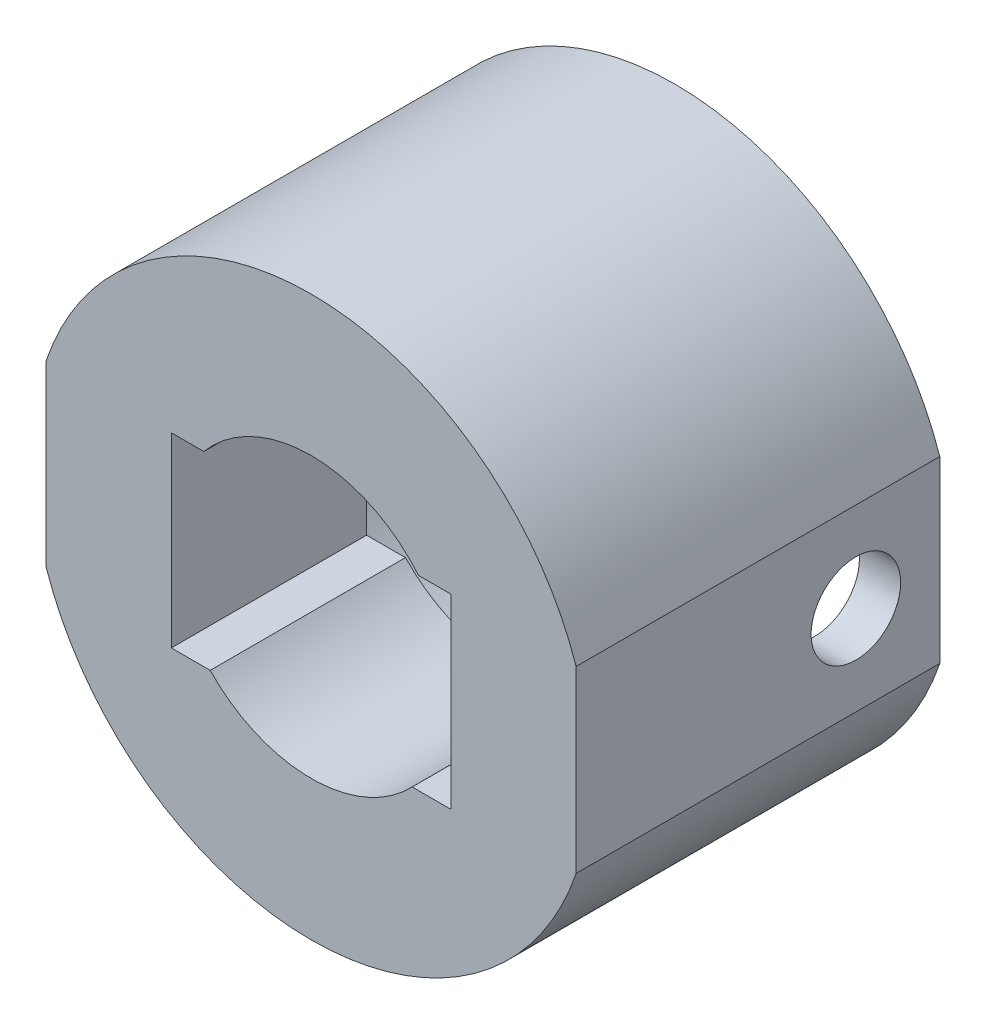
ISO-10303-21;
HEADER;
FILE_DESCRIPTION(('STEP AP214'),'2;1');
FILE_NAME('part.step','',(''),(''),'','','');
FILE_SCHEMA(('AUTOMOTIVE_DESIGN { 1 0 10303 214 1 1 1 1 }'));
ENDSEC;
DATA;
#1=APPLICATION_CONTEXT('core data for automotive mechanical design processes');
#2=APPLICATION_PROTOCOL_DEFINITION('international standard','automotive_design',2000,#1);
#3=PRODUCT_CONTEXT('',#1,'mechanical');
#4=PRODUCT('Part','Part','',(#3));
#5=PRODUCT_RELATED_PRODUCT_CATEGORY('part','',(#4));
#6=PRODUCT_DEFINITION_FORMATION('','',#4);
#7=PRODUCT_DEFINITION_CONTEXT('part definition',#1,'design');
#8=PRODUCT_DEFINITION('design','',#6,#7);
#9=PRODUCT_DEFINITION_SHAPE('','',#8);
#10=(LENGTH_UNIT() NAMED_UNIT(*) SI_UNIT(.MILLI.,.METRE.));
#11=(NAMED_UNIT(*) PLANE_ANGLE_UNIT() SI_UNIT($,.RADIAN.));
#12=(NAMED_UNIT(*) SI_UNIT($,.STERADIAN.) SOLID_ANGLE_UNIT());
#13=UNCERTAINTY_MEASURE_WITH_UNIT(LENGTH_MEASURE(1.E-05),#10,'distance_accuracy_value','');
#14=(GEOMETRIC_REPRESENTATION_CONTEXT(3) GLOBAL_UNCERTAINTY_ASSIGNED_CONTEXT((#13)) GLOBAL_UNIT_ASSIGNED_CONTEXT((#10,
#11,#12)) REPRESENTATION_CONTEXT('',''));
#15=CARTESIAN_POINT('',(0.,0.,0.));
#16=DIRECTION('',(0.,0.,1.));
#17=DIRECTION('',(1.,0.,0.));
#18=AXIS2_PLACEMENT_3D('',#15,#16,#17);
#19=CARTESIAN_POINT('',(0.,0.,0.));
#20=DIRECTION('',(0.,0.,1.));
#21=DIRECTION('',(1.,0.,0.));
#22=AXIS2_PLACEMENT_3D('',#19,#20,#21);
#23=PLANE('',#22);
#24=CARTESIAN_POINT('',(0.,0.,0.));
#25=DIRECTION('',(0.,0.,1.));
#26=DIRECTION('',(1.,0.,0.));
#27=AXIS2_PLACEMENT_3D('',#24,#25,#26);
#28=CIRCLE('',#27,10.);
#29=CARTESIAN_POINT('',(-9.47278087691455,-3.20412584927029,0.));
#30=VERTEX_POINT('',#29);
#31=CARTESIAN_POINT('',(9.47278087691455,-3.20412584927029,0.));
#32=VERTEX_POINT('',#31);
#33=EDGE_CURVE('E394',#30,#32,#28,.T.);
#34=ORIENTED_EDGE('',*,*,#33,.F.);
#35=DIRECTION('',(0.,-1.,0.));
#36=VECTOR('',#35,1.);
#37=CARTESIAN_POINT('',(-9.47278087691455,0.,0.));
#38=LINE('',#37,#36);
#39=CARTESIAN_POINT('',(-9.47278087691455,3.20412584927029,0.));
#40=VERTEX_POINT('',#39);
#41=EDGE_CURVE('E404',#40,#30,#38,.T.);
#42=ORIENTED_EDGE('',*,*,#41,.F.);
#43=CARTESIAN_POINT('',(0.,0.,0.));
#44=DIRECTION('',(0.,0.,1.));
#45=DIRECTION('',(1.,0.,0.));
#46=AXIS2_PLACEMENT_3D('',#43,#44,#45);
#47=CIRCLE('',#46,10.);
#48=CARTESIAN_POINT('',(9.47278087691455,3.20412584927029,0.));
#49=VERTEX_POINT('',#48);
#50=EDGE_CURVE('E402',#49,#40,#47,.T.);
#51=ORIENTED_EDGE('',*,*,#50,.F.);
#52=DIRECTION('',(0.,-1.,0.));
#53=VECTOR('',#52,1.);
#54=CARTESIAN_POINT('',(9.47278087691455,0.,0.));
#55=LINE('',#54,#53);
#56=EDGE_CURVE('E400',#49,#32,#55,.T.);
#57=ORIENTED_EDGE('',*,*,#56,.T.);
#58=EDGE_LOOP('',(#34,#42,#51,#57));
#59=FACE_BOUND('',#58,.T.);
#60=DIRECTION('',(-1.,0.,0.));
#61=VECTOR('',#60,1.);
#62=CARTESIAN_POINT('',(0.,-3.20412584927029,0.));
#63=LINE('',#62,#61);
#64=CARTESIAN_POINT('',(-7.33031906140776,-3.20412584927029,0.));
#65=VERTEX_POINT('',#64);
#66=CARTESIAN_POINT('',(-8.,-3.20412584927029,0.));
#67=VERTEX_POINT('',#66);
#68=EDGE_CURVE('E511',#65,#67,#63,.T.);
#69=ORIENTED_EDGE('',*,*,#68,.F.);
#70=CARTESIAN_POINT('',(0.,0.,0.));
#71=DIRECTION('',(0.,0.,-1.));
#72=DIRECTION('',(-1.,0.,0.));
#73=AXIS2_PLACEMENT_3D('',#70,#71,#72);
#74=CIRCLE('',#73,8.);
#75=CARTESIAN_POINT('',(7.33031906140776,-3.20412584927029,0.));
#76=VERTEX_POINT('',#75);
#77=EDGE_CURVE('E376',#76,#65,#74,.T.);
#78=ORIENTED_EDGE('',*,*,#77,.F.);
#79=CARTESIAN_POINT('',(8.,-3.20412584927029,0.));
#80=VERTEX_POINT('',#79);
#81=EDGE_CURVE('E236',#80,#76,#63,.T.);
#82=ORIENTED_EDGE('',*,*,#81,.F.);
#83=DIRECTION('',(0.,-1.,0.));
#84=VECTOR('',#83,1.);
#85=CARTESIAN_POINT('',(8.,3.20412584927029,0.));
#86=LINE('',#85,#84);
#87=CARTESIAN_POINT('',(8.,3.20412584927029,0.));
#88=VERTEX_POINT('',#87);
#89=EDGE_CURVE('E227',#88,#80,#86,.T.);
#90=ORIENTED_EDGE('',*,*,#89,.F.);
#91=DIRECTION('',(1.,0.,0.));
#92=VECTOR('',#91,1.);
#93=CARTESIAN_POINT('',(0.,3.20412584927029,0.));
#94=LINE('',#93,#92);
#95=CARTESIAN_POINT('',(7.33031906140776,3.20412584927029,0.));
#96=VERTEX_POINT('',#95);
#97=EDGE_CURVE('E215',#96,#88,#94,.T.);
#98=ORIENTED_EDGE('',*,*,#97,.F.);
#99=CARTESIAN_POINT('',(-7.33031906140776,3.20412584927029,0.));
#100=VERTEX_POINT('',#99);
#101=EDGE_CURVE('E381',#100,#96,#74,.T.);
#102=ORIENTED_EDGE('',*,*,#101,.F.);
#103=CARTESIAN_POINT('',(-8.,3.20412584927029,0.));
#104=VERTEX_POINT('',#103);
#105=EDGE_CURVE('E91',#104,#100,#94,.T.);
#106=ORIENTED_EDGE('',*,*,#105,.F.);
#107=DIRECTION('',(0.,1.,0.));
#108=VECTOR('',#107,1.);
#109=CARTESIAN_POINT('',(-8.,-3.20412584927029,0.));
#110=LINE('',#109,#108);
#111=EDGE_CURVE('E233',#67,#104,#110,.T.);
#112=ORIENTED_EDGE('',*,*,#111,.F.);
#113=EDGE_LOOP('',(#69,#78,#82,#90,#98,#102,#106,#112));
#114=FACE_BOUND('',#113,.T.);
#115=ADVANCED_FACE('F73',(#59,#114),#23,.F.);
#116=CARTESIAN_POINT('',(0.,0.,4.62));
#117=DIRECTION('',(0.,0.,-1.));
#118=DIRECTION('',(-1.,0.,0.));
#119=AXIS2_PLACEMENT_3D('',#116,#117,#118);
#120=CYLINDRICAL_SURFACE('',#119,8.);
#121=ORIENTED_EDGE('',*,*,#77,.T.);
#122=DIRECTION('',(0.,0.,-1.));
#123=VECTOR('',#122,1.);
#124=CARTESIAN_POINT('',(-7.33031906140776,-3.20412584927029,4.62));
#125=LINE('',#124,#123);
#126=CARTESIAN_POINT('',(-7.33031906140776,-3.20412584927029,6.02));
#127=VERTEX_POINT('',#126);
#128=EDGE_CURVE('E271',#65,#127,#125,.F.);
#129=ORIENTED_EDGE('',*,*,#128,.T.);
#130=CARTESIAN_POINT('',(0.,0.,6.02));
#131=DIRECTION('',(0.,0.,-1.));
#132=DIRECTION('',(-1.,0.,0.));
#133=AXIS2_PLACEMENT_3D('',#130,#131,#132);
#134=CIRCLE('',#133,8.);
#135=CARTESIAN_POINT('',(7.33031906140776,-3.20412584927029,6.02));
#136=VERTEX_POINT('',#135);
#137=EDGE_CURVE('E310',#136,#127,#134,.T.);
#138=ORIENTED_EDGE('',*,*,#137,.F.);
#139=DIRECTION('',(0.,0.,-1.));
#140=VECTOR('',#139,1.);
#141=CARTESIAN_POINT('',(7.33031906140776,-3.20412584927029,4.62));
#142=LINE('',#141,#140);
#143=EDGE_CURVE('E267',#136,#76,#142,.T.);
#144=ORIENTED_EDGE('',*,*,#143,.T.);
#145=EDGE_LOOP('',(#121,#129,#138,#144));
#146=FACE_BOUND('',#145,.T.);
#147=ADVANCED_FACE('F455',(#146),#120,.F.);
#148=CARTESIAN_POINT('',(-5.,0.,-23.62));
#149=DIRECTION('',(-1.,0.,0.));
#150=DIRECTION('',(0.,0.,1.));
#151=AXIS2_PLACEMENT_3D('',#148,#149,#150);
#152=PLANE('',#151);
#153=DIRECTION('',(0.,1.,0.));
#154=VECTOR('',#153,1.);
#155=CARTESIAN_POINT('',(-5.,-3.45810074592282,6.02));
#156=LINE('',#155,#154);
#157=CARTESIAN_POINT('',(-5.,-3.45810074592282,6.02));
#158=VERTEX_POINT('',#157);
#159=CARTESIAN_POINT('',(-5.,3.20412584927029,6.02));
#160=VERTEX_POINT('',#159);
#161=EDGE_CURVE('E292',#158,#160,#156,.T.);
#162=ORIENTED_EDGE('',*,*,#161,.T.);
#163=DIRECTION('',(0.,0.,1.));
#164=VECTOR('',#163,1.);
#165=CARTESIAN_POINT('',(-5.,3.20412584927029,-23.62));
#166=LINE('',#165,#164);
#167=CARTESIAN_POINT('',(-5.,3.20412584927029,13.));
#168=VERTEX_POINT('',#167);
#169=EDGE_CURVE('E368',#160,#168,#166,.T.);
#170=ORIENTED_EDGE('',*,*,#169,.T.);
#171=DIRECTION('',(0.,1.,0.));
#172=VECTOR('',#171,1.);
#173=CARTESIAN_POINT('',(-5.,0.,13.));
#174=LINE('',#173,#172);
#175=CARTESIAN_POINT('',(-5.,-3.45810074592282,13.));
#176=VERTEX_POINT('',#175);
#177=EDGE_CURVE('E337',#176,#168,#174,.T.);
#178=ORIENTED_EDGE('',*,*,#177,.F.);
#179=DIRECTION('',(0.,0.,1.));
#180=VECTOR('',#179,1.);
#181=CARTESIAN_POINT('',(-5.,-3.45810074592282,-23.62));
#182=LINE('',#181,#180);
#183=EDGE_CURVE('E364',#158,#176,#182,.T.);
#184=ORIENTED_EDGE('',*,*,#183,.F.);
#185=EDGE_LOOP('',(#162,#170,#178,#184));
#186=FACE_BOUND('',#185,.T.);
#187=ADVANCED_FACE('F458',(#186),#152,.F.);
#188=CARTESIAN_POINT('',(0.,-3.45810074592282,-23.62));
#189=DIRECTION('',(0.,-1.,0.));
#190=DIRECTION('',(0.,0.,-1.));
#191=AXIS2_PLACEMENT_3D('',#188,#189,#190);
#192=PLANE('',#191);
#193=DIRECTION('',(-1.,0.,0.));
#194=VECTOR('',#193,1.);
#195=CARTESIAN_POINT('',(-3.61130713607248,-3.45810074592282,6.02));
#196=LINE('',#195,#194);
#197=CARTESIAN_POINT('',(-3.61130713607248,-3.45810074592282,6.02));
#198=VERTEX_POINT('',#197);
#199=EDGE_CURVE('E288',#198,#158,#196,.T.);
#200=ORIENTED_EDGE('',*,*,#199,.T.);
#201=ORIENTED_EDGE('',*,*,#183,.T.);
#202=DIRECTION('',(-1.,0.,0.));
#203=VECTOR('',#202,1.);
#204=CARTESIAN_POINT('',(0.,-3.45810074592282,13.));
#205=LINE('',#204,#203);
#206=CARTESIAN_POINT('',(-3.61130713607248,-3.45810074592282,13.));
#207=VERTEX_POINT('',#206);
#208=EDGE_CURVE('E335',#207,#176,#205,.T.);
#209=ORIENTED_EDGE('',*,*,#208,.F.);
#210=DIRECTION('',(0.,0.,1.));
#211=VECTOR('',#210,1.);
#212=CARTESIAN_POINT('',(-3.61130713607248,-3.45810074592282,-23.62));
#213=LINE('',#212,#211);
#214=EDGE_CURVE('E84',#198,#207,#213,.T.);
#215=ORIENTED_EDGE('',*,*,#214,.F.);
#216=EDGE_LOOP('',(#200,#201,#209,#215));
#217=FACE_BOUND('',#216,.T.);
#218=ADVANCED_FACE('F600',(#217),#192,.F.);
#219=CARTESIAN_POINT('',(0.,-3.45810074592282,-23.62));
#220=DIRECTION('',(0.,-1.,0.));
#221=DIRECTION('',(0.,0.,-1.));
#222=AXIS2_PLACEMENT_3D('',#219,#220,#221);
#223=PLANE('',#222);
#224=DIRECTION('',(-1.,0.,0.));
#225=VECTOR('',#224,1.);
#226=CARTESIAN_POINT('',(5.,-3.45810074592282,6.02));
#227=LINE('',#226,#225);
#228=CARTESIAN_POINT('',(5.,-3.45810074592282,6.02));
#229=VERTEX_POINT('',#228);
#230=CARTESIAN_POINT('',(3.61130713607248,-3.45810074592282,6.02));
#231=VERTEX_POINT('',#230);
#232=EDGE_CURVE('E278',#229,#231,#227,.T.);
#233=ORIENTED_EDGE('',*,*,#232,.T.);
#234=DIRECTION('',(0.,0.,1.));
#235=VECTOR('',#234,1.);
#236=CARTESIAN_POINT('',(3.61130713607248,-3.45810074592282,-23.62));
#237=LINE('',#236,#235);
#238=CARTESIAN_POINT('',(3.61130713607248,-3.45810074592282,13.));
#239=VERTEX_POINT('',#238);
#240=EDGE_CURVE('E12',#231,#239,#237,.T.);
#241=ORIENTED_EDGE('',*,*,#240,.T.);
#242=DIRECTION('',(-1.,0.,0.));
#243=VECTOR('',#242,1.);
#244=CARTESIAN_POINT('',(0.,-3.45810074592282,13.));
#245=LINE('',#244,#243);
#246=CARTESIAN_POINT('',(5.,-3.45810074592282,13.));
#247=VERTEX_POINT('',#246);
#248=EDGE_CURVE('E321',#247,#239,#245,.T.);
#249=ORIENTED_EDGE('',*,*,#248,.F.);
#250=DIRECTION('',(0.,0.,1.));
#251=VECTOR('',#250,1.);
#252=CARTESIAN_POINT('',(5.,-3.45810074592282,-23.62));
#253=LINE('',#252,#251);
#254=EDGE_CURVE('E373',#229,#247,#253,.T.);
#255=ORIENTED_EDGE('',*,*,#254,.F.);
#256=EDGE_LOOP('',(#233,#241,#249,#255));
#257=FACE_BOUND('',#256,.T.);
#258=ADVANCED_FACE('F609',(#257),#223,.F.);
#259=CARTESIAN_POINT('',(5.,0.,-23.62));
#260=DIRECTION('',(1.,0.,0.));
#261=DIRECTION('',(0.,0.,-1.));
#262=AXIS2_PLACEMENT_3D('',#259,#260,#261);
#263=PLANE('',#262);
#264=DIRECTION('',(0.,-1.,0.));
#265=VECTOR('',#264,1.);
#266=CARTESIAN_POINT('',(5.,3.20412584927029,6.02));
#267=LINE('',#266,#265);
#268=CARTESIAN_POINT('',(5.,3.20412584927029,6.02));
#269=VERTEX_POINT('',#268);
#270=EDGE_CURVE('E280',#269,#229,#267,.T.);
#271=ORIENTED_EDGE('',*,*,#270,.T.);
#272=ORIENTED_EDGE('',*,*,#254,.T.);
#273=DIRECTION('',(0.,-1.,0.));
#274=VECTOR('',#273,1.);
#275=CARTESIAN_POINT('',(5.,0.,13.));
#276=LINE('',#275,#274);
#277=CARTESIAN_POINT('',(5.,3.20412584927029,13.));
#278=VERTEX_POINT('',#277);
#279=EDGE_CURVE('E318',#278,#247,#276,.T.);
#280=ORIENTED_EDGE('',*,*,#279,.F.);
#281=DIRECTION('',(0.,0.,1.));
#282=VECTOR('',#281,1.);
#283=CARTESIAN_POINT('',(5.,3.20412584927029,-23.62));
#284=LINE('',#283,#282);
#285=EDGE_CURVE('E362',#269,#278,#284,.T.);
#286=ORIENTED_EDGE('',*,*,#285,.F.);
#287=EDGE_LOOP('',(#271,#272,#280,#286));
#288=FACE_BOUND('',#287,.T.);
#289=ADVANCED_FACE('F619',(#288),#263,.F.);
#290=CARTESIAN_POINT('',(0.,3.20412584927029,-23.62));
#291=DIRECTION('',(0.,1.,0.));
#292=DIRECTION('',(0.,0.,1.));
#293=AXIS2_PLACEMENT_3D('',#290,#291,#292);
#294=PLANE('',#293);
#295=DIRECTION('',(1.,0.,0.));
#296=VECTOR('',#295,1.);
#297=CARTESIAN_POINT('',(-5.,3.20412584927029,6.02));
#298=LINE('',#297,#296);
#299=CARTESIAN_POINT('',(-3.83843425657363,3.20412584927029,6.02));
#300=VERTEX_POINT('',#299);
#301=EDGE_CURVE('E294',#160,#300,#298,.T.);
#302=ORIENTED_EDGE('',*,*,#301,.T.);
#303=DIRECTION('',(0.,0.,1.));
#304=VECTOR('',#303,1.);
#305=CARTESIAN_POINT('',(-3.83843425657363,3.20412584927029,-23.62));
#306=LINE('',#305,#304);
#307=CARTESIAN_POINT('',(-3.83843425657363,3.20412584927029,13.));
#308=VERTEX_POINT('',#307);
#309=EDGE_CURVE('E359',#300,#308,#306,.T.);
#310=ORIENTED_EDGE('',*,*,#309,.T.);
#311=DIRECTION('',(1.,0.,0.));
#312=VECTOR('',#311,1.);
#313=CARTESIAN_POINT('',(0.,3.20412584927029,13.));
#314=LINE('',#313,#312);
#315=EDGE_CURVE('E338',#168,#308,#314,.T.);
#316=ORIENTED_EDGE('',*,*,#315,.F.);
#317=ORIENTED_EDGE('',*,*,#169,.F.);
#318=EDGE_LOOP('',(#302,#310,#316,#317));
#319=FACE_BOUND('',#318,.T.);
#320=ADVANCED_FACE('F635',(#319),#294,.F.);
#321=CARTESIAN_POINT('',(0.,3.20412584927029,-23.62));
#322=DIRECTION('',(0.,1.,0.));
#323=DIRECTION('',(0.,0.,1.));
#324=AXIS2_PLACEMENT_3D('',#321,#322,#323);
#325=PLANE('',#324);
#326=DIRECTION('',(1.,0.,0.));
#327=VECTOR('',#326,1.);
#328=CARTESIAN_POINT('',(3.83843425657363,3.20412584927029,6.02));
#329=LINE('',#328,#327);
#330=CARTESIAN_POINT('',(3.83843425657363,3.20412584927029,6.02));
#331=VERTEX_POINT('',#330);
#332=EDGE_CURVE('E303',#331,#269,#329,.T.);
#333=ORIENTED_EDGE('',*,*,#332,.T.);
#334=ORIENTED_EDGE('',*,*,#285,.T.);
#335=DIRECTION('',(1.,0.,0.));
#336=VECTOR('',#335,1.);
#337=CARTESIAN_POINT('',(0.,3.20412584927029,13.));
#338=LINE('',#337,#336);
#339=CARTESIAN_POINT('',(3.83843425657363,3.20412584927029,13.));
#340=VERTEX_POINT('',#339);
#341=EDGE_CURVE('E317',#340,#278,#338,.T.);
#342=ORIENTED_EDGE('',*,*,#341,.F.);
#343=DIRECTION('',(0.,0.,1.));
#344=VECTOR('',#343,1.);
#345=CARTESIAN_POINT('',(3.83843425657363,3.20412584927029,-23.62));
#346=LINE('',#345,#344);
#347=EDGE_CURVE('E363',#331,#340,#346,.T.);
#348=ORIENTED_EDGE('',*,*,#347,.F.);
#349=EDGE_LOOP('',(#333,#334,#342,#348));
#350=FACE_BOUND('',#349,.T.);
#351=ADVANCED_FACE('F641',(#350),#325,.F.);
#352=CARTESIAN_POINT('',(0.,0.,-23.62));
#353=DIRECTION('',(0.,0.,1.));
#354=DIRECTION('',(1.,0.,0.));
#355=AXIS2_PLACEMENT_3D('',#352,#353,#354);
#356=CYLINDRICAL_SURFACE('',#355,5.);
#357=ORIENTED_EDGE('',*,*,#309,.F.);
#358=CARTESIAN_POINT('',(0.,0.,6.02));
#359=DIRECTION('',(0.,0.,-1.));
#360=DIRECTION('',(-1.,0.,0.));
#361=AXIS2_PLACEMENT_3D('',#358,#359,#360);
#362=CIRCLE('',#361,5.);
#363=EDGE_CURVE('E299',#300,#331,#362,.T.);
#364=ORIENTED_EDGE('',*,*,#363,.T.);
#365=ORIENTED_EDGE('',*,*,#347,.T.);
#366=CARTESIAN_POINT('',(0.,0.,13.));
#367=DIRECTION('',(0.,0.,1.));
#368=DIRECTION('',(1.,0.,0.));
#369=AXIS2_PLACEMENT_3D('',#366,#367,#368);
#370=CIRCLE('',#369,5.);
#371=EDGE_CURVE('E315',#308,#340,#370,.F.);
#372=ORIENTED_EDGE('',*,*,#371,.F.);
#373=EDGE_LOOP('',(#357,#364,#365,#372));
#374=FACE_BOUND('',#373,.T.);
#375=ADVANCED_FACE('F656',(#374),#356,.F.);
#376=ORIENTED_EDGE('',*,*,#240,.F.);
#377=CARTESIAN_POINT('',(0.,0.,6.02));
#378=DIRECTION('',(0.,0.,-1.));
#379=DIRECTION('',(-1.,0.,0.));
#380=AXIS2_PLACEMENT_3D('',#377,#378,#379);
#381=CIRCLE('',#380,5.);
#382=EDGE_CURVE('E281',#231,#198,#381,.T.);
#383=ORIENTED_EDGE('',*,*,#382,.T.);
#384=ORIENTED_EDGE('',*,*,#214,.T.);
#385=CARTESIAN_POINT('',(0.,0.,13.));
#386=DIRECTION('',(0.,0.,1.));
#387=DIRECTION('',(1.,0.,0.));
#388=AXIS2_PLACEMENT_3D('',#385,#386,#387);
#389=CIRCLE('',#388,5.);
#390=EDGE_CURVE('E329',#239,#207,#389,.F.);
#391=ORIENTED_EDGE('',*,*,#390,.F.);
#392=EDGE_LOOP('',(#376,#383,#384,#391));
#393=FACE_BOUND('',#392,.T.);
#394=ADVANCED_FACE('F474',(#393),#356,.F.);
#395=CARTESIAN_POINT('',(0.,0.,10.));
#396=DIRECTION('',(0.,0.,-1.));
#397=DIRECTION('',(-1.,0.,0.));
#398=AXIS2_PLACEMENT_3D('',#395,#396,#397);
#399=CYLINDRICAL_SURFACE('',#398,10.);
#400=ORIENTED_EDGE('',*,*,#33,.T.);
#401=DIRECTION('',(0.,0.,-1.));
#402=VECTOR('',#401,1.);
#403=CARTESIAN_POINT('',(9.47278087691455,-3.20412584927029,10.));
#404=LINE('',#403,#402);
#405=CARTESIAN_POINT('',(9.47278087691455,-3.20412584927029,13.));
#406=VERTEX_POINT('',#405);
#407=EDGE_CURVE('E80',#406,#32,#404,.T.);
#408=ORIENTED_EDGE('',*,*,#407,.F.);
#409=CARTESIAN_POINT('',(0.,0.,13.));
#410=DIRECTION('',(0.,0.,1.));
#411=DIRECTION('',(1.,0.,0.));
#412=AXIS2_PLACEMENT_3D('',#409,#410,#411);
#413=CIRCLE('',#412,10.);
#414=CARTESIAN_POINT('',(-9.47278087691455,-3.20412584927029,13.));
#415=VERTEX_POINT('',#414);
#416=EDGE_CURVE('E349',#415,#406,#413,.T.);
#417=ORIENTED_EDGE('',*,*,#416,.F.);
#418=DIRECTION('',(0.,0.,-1.));
#419=VECTOR('',#418,1.);
#420=CARTESIAN_POINT('',(-9.47278087691455,-3.20412584927029,10.));
#421=LINE('',#420,#419);
#422=EDGE_CURVE('E410',#415,#30,#421,.T.);
#423=ORIENTED_EDGE('',*,*,#422,.T.);
#424=EDGE_LOOP('',(#400,#408,#417,#423));
#425=FACE_BOUND('',#424,.T.);
#426=ADVANCED_FACE('F74',(#425),#399,.T.);
#427=CARTESIAN_POINT('',(9.47278087691455,0.,10.));
#428=DIRECTION('',(1.,0.,0.));
#429=DIRECTION('',(0.,0.,-1.));
#430=AXIS2_PLACEMENT_3D('',#427,#428,#429);
#431=PLANE('',#430);
#432=CARTESIAN_POINT('',(9.47278087691455,0.,3.));
#433=DIRECTION('',(1.,0.,0.));
#434=DIRECTION('',(0.,0.,-1.));
#435=AXIS2_PLACEMENT_3D('',#432,#433,#434);
#436=CIRCLE('',#435,1.6);
#437=CARTESIAN_POINT('',(9.47278087691455,0.,1.4));
#438=VERTEX_POINT('',#437);
#439=EDGE_CURVE('E386',#438,#438,#436,.T.);
#440=ORIENTED_EDGE('',*,*,#439,.F.);
#441=EDGE_LOOP('',(#440));
#442=FACE_BOUND('',#441,.T.);
#443=ORIENTED_EDGE('',*,*,#56,.F.);
#444=DIRECTION('',(0.,0.,-1.));
#445=VECTOR('',#444,1.);
#446=CARTESIAN_POINT('',(9.47278087691455,3.20412584927029,10.));
#447=LINE('',#446,#445);
#448=CARTESIAN_POINT('',(9.47278087691455,3.20412584927029,13.));
#449=VERTEX_POINT('',#448);
#450=EDGE_CURVE('E411',#449,#49,#447,.T.);
#451=ORIENTED_EDGE('',*,*,#450,.F.);
#452=DIRECTION('',(0.,1.,0.));
#453=VECTOR('',#452,1.);
#454=CARTESIAN_POINT('',(9.47278087691455,0.,13.));
#455=LINE('',#454,#453);
#456=EDGE_CURVE('E355',#406,#449,#455,.T.);
#457=ORIENTED_EDGE('',*,*,#456,.F.);
#458=ORIENTED_EDGE('',*,*,#407,.T.);
#459=EDGE_LOOP('',(#443,#451,#457,#458));
#460=FACE_BOUND('',#459,.T.);
#461=ADVANCED_FACE('F421',(#442,#460),#431,.T.);
#462=CARTESIAN_POINT('',(0.,0.,10.));
#463=DIRECTION('',(0.,0.,-1.));
#464=DIRECTION('',(-1.,0.,0.));
#465=AXIS2_PLACEMENT_3D('',#462,#463,#464);
#466=CYLINDRICAL_SURFACE('',#465,10.);
#467=ORIENTED_EDGE('',*,*,#50,.T.);
#468=DIRECTION('',(0.,0.,-1.));
#469=VECTOR('',#468,1.);
#470=CARTESIAN_POINT('',(-9.47278087691455,3.20412584927029,10.));
#471=LINE('',#470,#469);
#472=CARTESIAN_POINT('',(-9.47278087691455,3.20412584927029,13.));
#473=VERTEX_POINT('',#472);
#474=EDGE_CURVE('E412',#473,#40,#471,.T.);
#475=ORIENTED_EDGE('',*,*,#474,.F.);
#476=CARTESIAN_POINT('',(0.,0.,13.));
#477=DIRECTION('',(0.,0.,1.));
#478=DIRECTION('',(1.,0.,0.));
#479=AXIS2_PLACEMENT_3D('',#476,#477,#478);
#480=CIRCLE('',#479,10.);
#481=EDGE_CURVE('E358',#449,#473,#480,.T.);
#482=ORIENTED_EDGE('',*,*,#481,.F.);
#483=ORIENTED_EDGE('',*,*,#450,.T.);
#484=EDGE_LOOP('',(#467,#475,#482,#483));
#485=FACE_BOUND('',#484,.T.);
#486=ADVANCED_FACE('F429',(#485),#466,.T.);
#487=CARTESIAN_POINT('',(-9.47278087691455,0.,10.));
#488=DIRECTION('',(1.,0.,0.));
#489=DIRECTION('',(0.,0.,-1.));
#490=AXIS2_PLACEMENT_3D('',#487,#488,#489);
#491=PLANE('',#490);
#492=CARTESIAN_POINT('',(-9.47278087691455,0.,3.));
#493=DIRECTION('',(-1.,0.,0.));
#494=DIRECTION('',(0.,0.,1.));
#495=AXIS2_PLACEMENT_3D('',#492,#493,#494);
#496=CIRCLE('',#495,1.6);
#497=CARTESIAN_POINT('',(-9.47278087691455,0.,4.6));
#498=VERTEX_POINT('',#497);
#499=EDGE_CURVE('E383',#498,#498,#496,.T.);
#500=ORIENTED_EDGE('',*,*,#499,.F.);
#501=EDGE_LOOP('',(#500));
#502=FACE_BOUND('',#501,.T.);
#503=ORIENTED_EDGE('',*,*,#41,.T.);
#504=ORIENTED_EDGE('',*,*,#422,.F.);
#505=DIRECTION('',(0.,-1.,0.));
#506=VECTOR('',#505,1.);
#507=CARTESIAN_POINT('',(-9.47278087691455,0.,13.));
#508=LINE('',#507,#506);
#509=EDGE_CURVE('E341',#473,#415,#508,.T.);
#510=ORIENTED_EDGE('',*,*,#509,.F.);
#511=ORIENTED_EDGE('',*,*,#474,.T.);
#512=EDGE_LOOP('',(#503,#504,#510,#511));
#513=FACE_BOUND('',#512,.T.);
#514=ADVANCED_FACE('F435',(#502,#513),#491,.F.);
#515=CARTESIAN_POINT('',(17.5272191230855,0.,3.));
#516=DIRECTION('',(-1.,0.,0.));
#517=DIRECTION('',(0.,0.,1.));
#518=AXIS2_PLACEMENT_3D('',#515,#516,#517);
#519=CYLINDRICAL_SURFACE('',#518,1.6);
#520=CARTESIAN_POINT('',(-8.,0.,3.));
#521=DIRECTION('',(-1.,0.,0.));
#522=DIRECTION('',(0.,0.,1.));
#523=AXIS2_PLACEMENT_3D('',#520,#521,#522);
#524=CIRCLE('',#523,1.6);
#525=CARTESIAN_POINT('',(-8.,0.,4.6));
#526=VERTEX_POINT('',#525);
#527=EDGE_CURVE('E257',#526,#526,#524,.F.);
#528=ORIENTED_EDGE('',*,*,#527,.T.);
#529=EDGE_LOOP('',(#528));
#530=FACE_BOUND('',#529,.T.);
#531=ORIENTED_EDGE('',*,*,#499,.T.);
#532=EDGE_LOOP('',(#531));
#533=FACE_BOUND('',#532,.T.);
#534=ADVANCED_FACE('F464',(#530,#533),#519,.F.);
#535=ORIENTED_EDGE('',*,*,#439,.T.);
#536=EDGE_LOOP('',(#535));
#537=FACE_BOUND('',#536,.T.);
#538=CARTESIAN_POINT('',(8.,0.,3.));
#539=DIRECTION('',(1.,0.,0.));
#540=DIRECTION('',(0.,0.,-1.));
#541=AXIS2_PLACEMENT_3D('',#538,#539,#540);
#542=CIRCLE('',#541,1.6);
#543=CARTESIAN_POINT('',(8.,0.,1.4));
#544=VERTEX_POINT('',#543);
#545=EDGE_CURVE('E258',#544,#544,#542,.F.);
#546=ORIENTED_EDGE('',*,*,#545,.T.);
#547=EDGE_LOOP('',(#546));
#548=FACE_BOUND('',#547,.T.);
#549=ADVANCED_FACE('F446',(#537,#548),#519,.F.);
#550=ORIENTED_EDGE('',*,*,#101,.T.);
#551=DIRECTION('',(0.,0.,-1.));
#552=VECTOR('',#551,1.);
#553=CARTESIAN_POINT('',(7.33031906140776,3.20412584927029,4.62));
#554=LINE('',#553,#552);
#555=CARTESIAN_POINT('',(7.33031906140776,3.20412584927029,6.02));
#556=VERTEX_POINT('',#555);
#557=EDGE_CURVE('E217',#96,#556,#554,.F.);
#558=ORIENTED_EDGE('',*,*,#557,.T.);
#559=CARTESIAN_POINT('',(-7.33031906140776,3.20412584927029,6.02));
#560=VERTEX_POINT('',#559);
#561=EDGE_CURVE('E311',#560,#556,#134,.T.);
#562=ORIENTED_EDGE('',*,*,#561,.F.);
#563=DIRECTION('',(0.,0.,-1.));
#564=VECTOR('',#563,1.);
#565=CARTESIAN_POINT('',(-7.33031906140776,3.20412584927029,4.62));
#566=LINE('',#565,#564);
#567=EDGE_CURVE('E261',#560,#100,#566,.T.);
#568=ORIENTED_EDGE('',*,*,#567,.T.);
#569=EDGE_LOOP('',(#550,#558,#562,#568));
#570=FACE_BOUND('',#569,.T.);
#571=ADVANCED_FACE('F440',(#570),#120,.F.);
#572=CARTESIAN_POINT('',(0.,0.,13.));
#573=DIRECTION('',(0.,0.,1.));
#574=DIRECTION('',(1.,0.,0.));
#575=AXIS2_PLACEMENT_3D('',#572,#573,#574);
#576=PLANE('',#575);
#577=ORIENTED_EDGE('',*,*,#371,.T.);
#578=ORIENTED_EDGE('',*,*,#341,.T.);
#579=ORIENTED_EDGE('',*,*,#279,.T.);
#580=ORIENTED_EDGE('',*,*,#248,.T.);
#581=ORIENTED_EDGE('',*,*,#390,.T.);
#582=ORIENTED_EDGE('',*,*,#208,.T.);
#583=ORIENTED_EDGE('',*,*,#177,.T.);
#584=ORIENTED_EDGE('',*,*,#315,.T.);
#585=EDGE_LOOP('',(#577,#578,#579,#580,#581,#582,#583,#584));
#586=FACE_BOUND('',#585,.T.);
#587=ORIENTED_EDGE('',*,*,#509,.T.);
#588=ORIENTED_EDGE('',*,*,#416,.T.);
#589=ORIENTED_EDGE('',*,*,#456,.T.);
#590=ORIENTED_EDGE('',*,*,#481,.T.);
#591=EDGE_LOOP('',(#587,#588,#589,#590));
#592=FACE_BOUND('',#591,.T.);
#593=ADVANCED_FACE('F432',(#586,#592),#576,.T.);
#594=CARTESIAN_POINT('',(0.,0.,6.02));
#595=DIRECTION('',(0.,0.,-1.));
#596=DIRECTION('',(-1.,0.,0.));
#597=AXIS2_PLACEMENT_3D('',#594,#595,#596);
#598=PLANE('',#597);
#599=ORIENTED_EDGE('',*,*,#301,.F.);
#600=ORIENTED_EDGE('',*,*,#161,.F.);
#601=ORIENTED_EDGE('',*,*,#199,.F.);
#602=ORIENTED_EDGE('',*,*,#382,.F.);
#603=ORIENTED_EDGE('',*,*,#232,.F.);
#604=ORIENTED_EDGE('',*,*,#270,.F.);
#605=ORIENTED_EDGE('',*,*,#332,.F.);
#606=ORIENTED_EDGE('',*,*,#363,.F.);
#607=EDGE_LOOP('',(#599,#600,#601,#602,#603,#604,#605,#606));
#608=FACE_BOUND('',#607,.T.);
#609=ORIENTED_EDGE('',*,*,#561,.T.);
#610=DIRECTION('',(-1.,0.,0.));
#611=VECTOR('',#610,1.);
#612=CARTESIAN_POINT('',(0.,3.20412584927029,6.02));
#613=LINE('',#612,#611);
#614=CARTESIAN_POINT('',(8.,3.20412584927029,6.02));
#615=VERTEX_POINT('',#614);
#616=EDGE_CURVE('E100',#615,#556,#613,.T.);
#617=ORIENTED_EDGE('',*,*,#616,.F.);
#618=DIRECTION('',(0.,1.,0.));
#619=VECTOR('',#618,1.);
#620=CARTESIAN_POINT('',(8.,3.20412584927029,6.02));
#621=LINE('',#620,#619);
#622=CARTESIAN_POINT('',(8.,-3.20412584927029,6.02000000000001));
#623=VERTEX_POINT('',#622);
#624=EDGE_CURVE('E225',#623,#615,#621,.T.);
#625=ORIENTED_EDGE('',*,*,#624,.F.);
#626=DIRECTION('',(1.,0.,0.));
#627=VECTOR('',#626,1.);
#628=CARTESIAN_POINT('',(0.,-3.20412584927029,6.02));
#629=LINE('',#628,#627);
#630=EDGE_CURVE('E504',#136,#623,#629,.T.);
#631=ORIENTED_EDGE('',*,*,#630,.F.);
#632=ORIENTED_EDGE('',*,*,#137,.T.);
#633=CARTESIAN_POINT('',(-8.,-3.20412584927029,6.02));
#634=VERTEX_POINT('',#633);
#635=EDGE_CURVE('E508',#634,#127,#629,.T.);
#636=ORIENTED_EDGE('',*,*,#635,.F.);
#637=DIRECTION('',(0.,-1.,0.));
#638=VECTOR('',#637,1.);
#639=CARTESIAN_POINT('',(-8.,-3.20412584927029,6.02));
#640=LINE('',#639,#638);
#641=CARTESIAN_POINT('',(-8.,3.20412584927029,6.02));
#642=VERTEX_POINT('',#641);
#643=EDGE_CURVE('E245',#642,#634,#640,.T.);
#644=ORIENTED_EDGE('',*,*,#643,.F.);
#645=EDGE_CURVE('E514',#560,#642,#613,.T.);
#646=ORIENTED_EDGE('',*,*,#645,.F.);
#647=EDGE_LOOP('',(#609,#617,#625,#631,#632,#636,#644,#646));
#648=FACE_BOUND('',#647,.T.);
#649=ADVANCED_FACE('F436',(#608,#648),#598,.T.);
#650=CARTESIAN_POINT('',(0.,-3.20412584927029,23.2555936895672));
#651=DIRECTION('',(0.,-1.,0.));
#652=DIRECTION('',(0.,0.,-1.));
#653=AXIS2_PLACEMENT_3D('',#650,#651,#652);
#654=PLANE('',#653);
#655=ORIENTED_EDGE('',*,*,#68,.T.);
#656=DIRECTION('',(0.,0.,-1.));
#657=VECTOR('',#656,1.);
#658=CARTESIAN_POINT('',(-8.,-3.20412584927029,23.2555936895672));
#659=LINE('',#658,#657);
#660=EDGE_CURVE('E247',#634,#67,#659,.T.);
#661=ORIENTED_EDGE('',*,*,#660,.F.);
#662=ORIENTED_EDGE('',*,*,#635,.T.);
#663=ORIENTED_EDGE('',*,*,#128,.F.);
#664=EDGE_LOOP('',(#655,#661,#662,#663));
#665=FACE_BOUND('',#664,.T.);
#666=ADVANCED_FACE('F444',(#665),#654,.F.);
#667=CARTESIAN_POINT('',(0.,3.20412584927029,23.2555936895672));
#668=DIRECTION('',(0.,1.,0.));
#669=DIRECTION('',(0.,0.,1.));
#670=AXIS2_PLACEMENT_3D('',#667,#668,#669);
#671=PLANE('',#670);
#672=ORIENTED_EDGE('',*,*,#645,.T.);
#673=DIRECTION('',(0.,0.,-1.));
#674=VECTOR('',#673,1.);
#675=CARTESIAN_POINT('',(-8.,3.20412584927029,23.2555936895672));
#676=LINE('',#675,#674);
#677=EDGE_CURVE('E244',#642,#104,#676,.T.);
#678=ORIENTED_EDGE('',*,*,#677,.T.);
#679=ORIENTED_EDGE('',*,*,#105,.T.);
#680=ORIENTED_EDGE('',*,*,#567,.F.);
#681=EDGE_LOOP('',(#672,#678,#679,#680));
#682=FACE_BOUND('',#681,.T.);
#683=ADVANCED_FACE('F487',(#682),#671,.F.);
#684=CARTESIAN_POINT('',(-8.,-3.20412584927029,23.2555936895672));
#685=DIRECTION('',(-1.,0.,0.));
#686=DIRECTION('',(0.,0.,1.));
#687=AXIS2_PLACEMENT_3D('',#684,#685,#686);
#688=PLANE('',#687);
#689=ORIENTED_EDGE('',*,*,#527,.F.);
#690=EDGE_LOOP('',(#689));
#691=FACE_BOUND('',#690,.T.);
#692=ORIENTED_EDGE('',*,*,#111,.T.);
#693=ORIENTED_EDGE('',*,*,#677,.F.);
#694=ORIENTED_EDGE('',*,*,#643,.T.);
#695=ORIENTED_EDGE('',*,*,#660,.T.);
#696=EDGE_LOOP('',(#692,#693,#694,#695));
#697=FACE_BOUND('',#696,.T.);
#698=ADVANCED_FACE('F490',(#691,#697),#688,.F.);
#699=ORIENTED_EDGE('',*,*,#630,.T.);
#700=DIRECTION('',(0.,0.,-1.));
#701=VECTOR('',#700,1.);
#702=CARTESIAN_POINT('',(8.,-3.20412584927029,23.2555936895672));
#703=LINE('',#702,#701);
#704=EDGE_CURVE('E229',#623,#80,#703,.T.);
#705=ORIENTED_EDGE('',*,*,#704,.T.);
#706=ORIENTED_EDGE('',*,*,#81,.T.);
#707=ORIENTED_EDGE('',*,*,#143,.F.);
#708=EDGE_LOOP('',(#699,#705,#706,#707));
#709=FACE_BOUND('',#708,.T.);
#710=ADVANCED_FACE('F484',(#709),#654,.F.);
#711=ORIENTED_EDGE('',*,*,#97,.T.);
#712=DIRECTION('',(0.,0.,-1.));
#713=VECTOR('',#712,1.);
#714=CARTESIAN_POINT('',(8.,3.20412584927029,23.2555936895672));
#715=LINE('',#714,#713);
#716=EDGE_CURVE('E213',#615,#88,#715,.T.);
#717=ORIENTED_EDGE('',*,*,#716,.F.);
#718=ORIENTED_EDGE('',*,*,#616,.T.);
#719=ORIENTED_EDGE('',*,*,#557,.F.);
#720=EDGE_LOOP('',(#711,#717,#718,#719));
#721=FACE_BOUND('',#720,.T.);
#722=ADVANCED_FACE('F211',(#721),#671,.F.);
#723=CARTESIAN_POINT('',(8.,3.20412584927029,23.2555936895672));
#724=DIRECTION('',(1.,0.,0.));
#725=DIRECTION('',(0.,0.,-1.));
#726=AXIS2_PLACEMENT_3D('',#723,#724,#725);
#727=PLANE('',#726);
#728=ORIENTED_EDGE('',*,*,#545,.F.);
#729=EDGE_LOOP('',(#728));
#730=FACE_BOUND('',#729,.T.);
#731=ORIENTED_EDGE('',*,*,#89,.T.);
#732=ORIENTED_EDGE('',*,*,#704,.F.);
#733=ORIENTED_EDGE('',*,*,#624,.T.);
#734=ORIENTED_EDGE('',*,*,#716,.T.);
#735=EDGE_LOOP('',(#731,#732,#733,#734));
#736=FACE_BOUND('',#735,.T.);
#737=ADVANCED_FACE('F224',(#730,#736),#727,.F.);
#738=CLOSED_SHELL('',(#115,#147,#187,#218,#258,#289,#320,#351,#375,#394,#426,#461,#486,#514,
#534,#549,#571,#593,#649,#666,#683,#698,#710,#722,#737));
#739=MANIFOLD_SOLID_BREP('B2',#738);
#740=ADVANCED_BREP_SHAPE_REPRESENTATION('',(#18,#739),#14);
#741=SHAPE_DEFINITION_REPRESENTATION(#9,#740);
ENDSEC;
END-ISO-10303-21;
